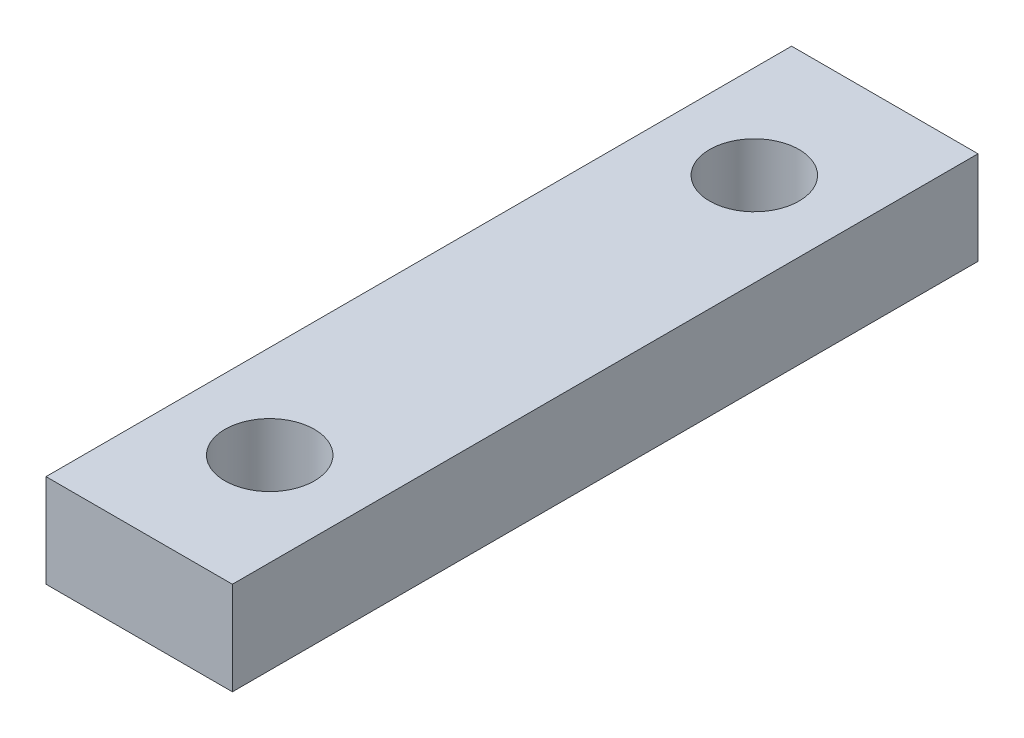
ISO-10303-21;
HEADER;
FILE_DESCRIPTION(('STEP AP214'),'2;1');
FILE_NAME('part.step','',(''),(''),'','','');
FILE_SCHEMA(('AUTOMOTIVE_DESIGN { 1 0 10303 214 1 1 1 1 }'));
ENDSEC;
DATA;
#1=APPLICATION_CONTEXT('core data for automotive mechanical design processes');
#2=APPLICATION_PROTOCOL_DEFINITION('international standard','automotive_design',2000,#1);
#3=PRODUCT_CONTEXT('',#1,'mechanical');
#4=PRODUCT('Part','Part','',(#3));
#5=PRODUCT_RELATED_PRODUCT_CATEGORY('part','',(#4));
#6=PRODUCT_DEFINITION_FORMATION('','',#4);
#7=PRODUCT_DEFINITION_CONTEXT('part definition',#1,'design');
#8=PRODUCT_DEFINITION('design','',#6,#7);
#9=PRODUCT_DEFINITION_SHAPE('','',#8);
#10=(LENGTH_UNIT() NAMED_UNIT(*) SI_UNIT(.MILLI.,.METRE.));
#11=(NAMED_UNIT(*) PLANE_ANGLE_UNIT() SI_UNIT($,.RADIAN.));
#12=(NAMED_UNIT(*) SI_UNIT($,.STERADIAN.) SOLID_ANGLE_UNIT());
#13=UNCERTAINTY_MEASURE_WITH_UNIT(LENGTH_MEASURE(1.E-05),#10,'distance_accuracy_value','');
#14=(GEOMETRIC_REPRESENTATION_CONTEXT(3) GLOBAL_UNCERTAINTY_ASSIGNED_CONTEXT((#13)) GLOBAL_UNIT_ASSIGNED_CONTEXT((#10,
#11,#12)) REPRESENTATION_CONTEXT('',''));
#15=CARTESIAN_POINT('',(0.,0.,0.));
#16=DIRECTION('',(0.,0.,1.));
#17=DIRECTION('',(1.,0.,0.));
#18=AXIS2_PLACEMENT_3D('',#15,#16,#17);
#19=CARTESIAN_POINT('',(0.,5.,0.));
#20=DIRECTION('',(0.,-1.,0.));
#21=DIRECTION('',(0.,0.,-1.));
#22=AXIS2_PLACEMENT_3D('',#19,#20,#21);
#23=PLANE('',#22);
#24=DIRECTION('',(0.,0.,-1.));
#25=VECTOR('',#24,1.);
#26=CARTESIAN_POINT('',(5.,5.,-20.047470576));
#27=LINE('',#26,#25);
#28=CARTESIAN_POINT('',(5.,5.,19.952529424));
#29=VERTEX_POINT('',#28);
#30=CARTESIAN_POINT('',(5.,5.,-20.047470576));
#31=VERTEX_POINT('',#30);
#32=EDGE_CURVE('E89',#29,#31,#27,.T.);
#33=ORIENTED_EDGE('',*,*,#32,.T.);
#34=DIRECTION('',(-1.,0.,0.));
#35=VECTOR('',#34,1.);
#36=CARTESIAN_POINT('',(-5.,5.,-20.047470576));
#37=LINE('',#36,#35);
#38=CARTESIAN_POINT('',(-5.,5.,-20.047470576));
#39=VERTEX_POINT('',#38);
#40=EDGE_CURVE('E84',#31,#39,#37,.T.);
#41=ORIENTED_EDGE('',*,*,#40,.T.);
#42=DIRECTION('',(0.,0.,1.));
#43=VECTOR('',#42,1.);
#44=CARTESIAN_POINT('',(-5.,5.,-20.047470576));
#45=LINE('',#44,#43);
#46=CARTESIAN_POINT('',(-5.,5.,19.952529424));
#47=VERTEX_POINT('',#46);
#48=EDGE_CURVE('E87',#39,#47,#45,.T.);
#49=ORIENTED_EDGE('',*,*,#48,.T.);
#50=DIRECTION('',(1.,0.,0.));
#51=VECTOR('',#50,1.);
#52=CARTESIAN_POINT('',(5.,5.,19.952529424));
#53=LINE('',#52,#51);
#54=EDGE_CURVE('E54',#47,#29,#53,.T.);
#55=ORIENTED_EDGE('',*,*,#54,.T.);
#56=EDGE_LOOP('',(#33,#41,#49,#55));
#57=FACE_BOUND('',#56,.T.);
#58=CARTESIAN_POINT('',(0.,5.,-13.047470576));
#59=DIRECTION('',(0.,1.,0.));
#60=DIRECTION('',(0.,0.,1.));
#61=AXIS2_PLACEMENT_3D('',#58,#59,#60);
#62=CIRCLE('',#61,2.4);
#63=CARTESIAN_POINT('',(0.,5.,-10.647470576));
#64=VERTEX_POINT('',#63);
#65=EDGE_CURVE('E104',#64,#64,#62,.T.);
#66=ORIENTED_EDGE('',*,*,#65,.F.);
#67=EDGE_LOOP('',(#66));
#68=FACE_BOUND('',#67,.T.);
#69=CARTESIAN_POINT('',(0.,5.,12.952529424));
#70=DIRECTION('',(0.,1.,0.));
#71=DIRECTION('',(0.,0.,-1.));
#72=AXIS2_PLACEMENT_3D('',#69,#70,#71);
#73=CIRCLE('',#72,2.4);
#74=CARTESIAN_POINT('',(0.,5.,10.552529424));
#75=VERTEX_POINT('',#74);
#76=EDGE_CURVE('E119',#75,#75,#73,.T.);
#77=ORIENTED_EDGE('',*,*,#76,.F.);
#78=EDGE_LOOP('',(#77));
#79=FACE_BOUND('',#78,.T.);
#80=ADVANCED_FACE('F37',(#57,#68,#79),#23,.F.);
#81=CARTESIAN_POINT('',(0.,0.,0.));
#82=DIRECTION('',(0.,-1.,0.));
#83=DIRECTION('',(0.,0.,-1.));
#84=AXIS2_PLACEMENT_3D('',#81,#82,#83);
#85=PLANE('',#84);
#86=CARTESIAN_POINT('',(0.,0.,-13.047470576));
#87=DIRECTION('',(0.,1.,0.));
#88=DIRECTION('',(0.,0.,1.));
#89=AXIS2_PLACEMENT_3D('',#86,#87,#88);
#90=CIRCLE('',#89,2.4);
#91=CARTESIAN_POINT('',(0.,0.,-10.647470576));
#92=VERTEX_POINT('',#91);
#93=EDGE_CURVE('E116',#92,#92,#90,.T.);
#94=ORIENTED_EDGE('',*,*,#93,.T.);
#95=EDGE_LOOP('',(#94));
#96=FACE_BOUND('',#95,.T.);
#97=DIRECTION('',(0.,0.,-1.));
#98=VECTOR('',#97,1.);
#99=CARTESIAN_POINT('',(5.,0.,-20.047470576));
#100=LINE('',#99,#98);
#101=CARTESIAN_POINT('',(5.,0.,19.952529424));
#102=VERTEX_POINT('',#101);
#103=CARTESIAN_POINT('',(5.,0.,-20.047470576));
#104=VERTEX_POINT('',#103);
#105=EDGE_CURVE('E101',#102,#104,#100,.T.);
#106=ORIENTED_EDGE('',*,*,#105,.F.);
#107=DIRECTION('',(1.,0.,0.));
#108=VECTOR('',#107,1.);
#109=CARTESIAN_POINT('',(5.,0.,19.952529424));
#110=LINE('',#109,#108);
#111=CARTESIAN_POINT('',(-5.,0.,19.952529424));
#112=VERTEX_POINT('',#111);
#113=EDGE_CURVE('E77',#112,#102,#110,.T.);
#114=ORIENTED_EDGE('',*,*,#113,.F.);
#115=DIRECTION('',(0.,0.,1.));
#116=VECTOR('',#115,1.);
#117=CARTESIAN_POINT('',(-5.,0.,-20.047470576));
#118=LINE('',#117,#116);
#119=CARTESIAN_POINT('',(-5.,0.,-20.047470576));
#120=VERTEX_POINT('',#119);
#121=EDGE_CURVE('E71',#120,#112,#118,.T.);
#122=ORIENTED_EDGE('',*,*,#121,.F.);
#123=DIRECTION('',(-1.,0.,0.));
#124=VECTOR('',#123,1.);
#125=CARTESIAN_POINT('',(-5.,0.,-20.047470576));
#126=LINE('',#125,#124);
#127=EDGE_CURVE('E93',#104,#120,#126,.T.);
#128=ORIENTED_EDGE('',*,*,#127,.F.);
#129=EDGE_LOOP('',(#106,#114,#122,#128));
#130=FACE_BOUND('',#129,.T.);
#131=CARTESIAN_POINT('',(0.,0.,12.952529424));
#132=DIRECTION('',(0.,1.,0.));
#133=DIRECTION('',(0.,0.,-1.));
#134=AXIS2_PLACEMENT_3D('',#131,#132,#133);
#135=CIRCLE('',#134,2.4);
#136=CARTESIAN_POINT('',(0.,0.,10.552529424));
#137=VERTEX_POINT('',#136);
#138=EDGE_CURVE('E122',#137,#137,#135,.T.);
#139=ORIENTED_EDGE('',*,*,#138,.T.);
#140=EDGE_LOOP('',(#139));
#141=FACE_BOUND('',#140,.T.);
#142=ADVANCED_FACE('F112',(#96,#130,#141),#85,.T.);
#143=CARTESIAN_POINT('',(5.,5.,-20.047470576));
#144=DIRECTION('',(-1.,0.,0.));
#145=DIRECTION('',(0.,0.,1.));
#146=AXIS2_PLACEMENT_3D('',#143,#144,#145);
#147=PLANE('',#146);
#148=ORIENTED_EDGE('',*,*,#105,.T.);
#149=DIRECTION('',(0.,-1.,0.));
#150=VECTOR('',#149,1.);
#151=CARTESIAN_POINT('',(5.,5.,-20.047470576));
#152=LINE('',#151,#150);
#153=EDGE_CURVE('E11',#31,#104,#152,.T.);
#154=ORIENTED_EDGE('',*,*,#153,.F.);
#155=ORIENTED_EDGE('',*,*,#32,.F.);
#156=DIRECTION('',(0.,-1.,0.));
#157=VECTOR('',#156,1.);
#158=CARTESIAN_POINT('',(5.,5.,19.952529424));
#159=LINE('',#158,#157);
#160=EDGE_CURVE('E97',#29,#102,#159,.T.);
#161=ORIENTED_EDGE('',*,*,#160,.T.);
#162=EDGE_LOOP('',(#148,#154,#155,#161));
#163=FACE_BOUND('',#162,.T.);
#164=ADVANCED_FACE('F39',(#163),#147,.F.);
#165=CARTESIAN_POINT('',(-5.,5.,-20.047470576));
#166=DIRECTION('',(0.,0.,1.));
#167=DIRECTION('',(1.,0.,0.));
#168=AXIS2_PLACEMENT_3D('',#165,#166,#167);
#169=PLANE('',#168);
#170=ORIENTED_EDGE('',*,*,#127,.T.);
#171=DIRECTION('',(0.,-1.,0.));
#172=VECTOR('',#171,1.);
#173=CARTESIAN_POINT('',(-5.,5.,-20.047470576));
#174=LINE('',#173,#172);
#175=EDGE_CURVE('E46',#39,#120,#174,.T.);
#176=ORIENTED_EDGE('',*,*,#175,.F.);
#177=ORIENTED_EDGE('',*,*,#40,.F.);
#178=ORIENTED_EDGE('',*,*,#153,.T.);
#179=EDGE_LOOP('',(#170,#176,#177,#178));
#180=FACE_BOUND('',#179,.T.);
#181=ADVANCED_FACE('F92',(#180),#169,.F.);
#182=CARTESIAN_POINT('',(-5.,5.,-20.047470576));
#183=DIRECTION('',(1.,0.,0.));
#184=DIRECTION('',(0.,0.,-1.));
#185=AXIS2_PLACEMENT_3D('',#182,#183,#184);
#186=PLANE('',#185);
#187=ORIENTED_EDGE('',*,*,#121,.T.);
#188=DIRECTION('',(0.,-1.,0.));
#189=VECTOR('',#188,1.);
#190=CARTESIAN_POINT('',(-5.,5.,19.952529424));
#191=LINE('',#190,#189);
#192=EDGE_CURVE('E94',#47,#112,#191,.T.);
#193=ORIENTED_EDGE('',*,*,#192,.F.);
#194=ORIENTED_EDGE('',*,*,#48,.F.);
#195=ORIENTED_EDGE('',*,*,#175,.T.);
#196=EDGE_LOOP('',(#187,#193,#194,#195));
#197=FACE_BOUND('',#196,.T.);
#198=ADVANCED_FACE('F95',(#197),#186,.F.);
#199=CARTESIAN_POINT('',(5.,5.,19.952529424));
#200=DIRECTION('',(0.,0.,-1.));
#201=DIRECTION('',(-1.,0.,0.));
#202=AXIS2_PLACEMENT_3D('',#199,#200,#201);
#203=PLANE('',#202);
#204=ORIENTED_EDGE('',*,*,#113,.T.);
#205=ORIENTED_EDGE('',*,*,#160,.F.);
#206=ORIENTED_EDGE('',*,*,#54,.F.);
#207=ORIENTED_EDGE('',*,*,#192,.T.);
#208=EDGE_LOOP('',(#204,#205,#206,#207));
#209=FACE_BOUND('',#208,.T.);
#210=ADVANCED_FACE('F109',(#209),#203,.F.);
#211=CARTESIAN_POINT('',(0.,5.,-13.047470576));
#212=DIRECTION('',(0.,-1.,0.));
#213=DIRECTION('',(0.,0.,-1.));
#214=AXIS2_PLACEMENT_3D('',#211,#212,#213);
#215=CYLINDRICAL_SURFACE('',#214,2.4);
#216=ORIENTED_EDGE('',*,*,#65,.T.);
#217=EDGE_LOOP('',(#216));
#218=FACE_BOUND('',#217,.T.);
#219=ORIENTED_EDGE('',*,*,#93,.F.);
#220=EDGE_LOOP('',(#219));
#221=FACE_BOUND('',#220,.T.);
#222=ADVANCED_FACE('F139',(#218,#221),#215,.F.);
#223=CARTESIAN_POINT('',(0.,5.,12.952529424));
#224=DIRECTION('',(0.,-1.,0.));
#225=DIRECTION('',(0.,0.,-1.));
#226=AXIS2_PLACEMENT_3D('',#223,#224,#225);
#227=CYLINDRICAL_SURFACE('',#226,2.4);
#228=ORIENTED_EDGE('',*,*,#76,.T.);
#229=EDGE_LOOP('',(#228));
#230=FACE_BOUND('',#229,.T.);
#231=ORIENTED_EDGE('',*,*,#138,.F.);
#232=EDGE_LOOP('',(#231));
#233=FACE_BOUND('',#232,.T.);
#234=ADVANCED_FACE('F128',(#230,#233),#227,.F.);
#235=CLOSED_SHELL('',(#80,#142,#164,#181,#198,#210,#222,#234));
#236=MANIFOLD_SOLID_BREP('B2',#235);
#237=ADVANCED_BREP_SHAPE_REPRESENTATION('',(#18,#236),#14);
#238=SHAPE_DEFINITION_REPRESENTATION(#9,#237);
ENDSEC;
END-ISO-10303-21;
